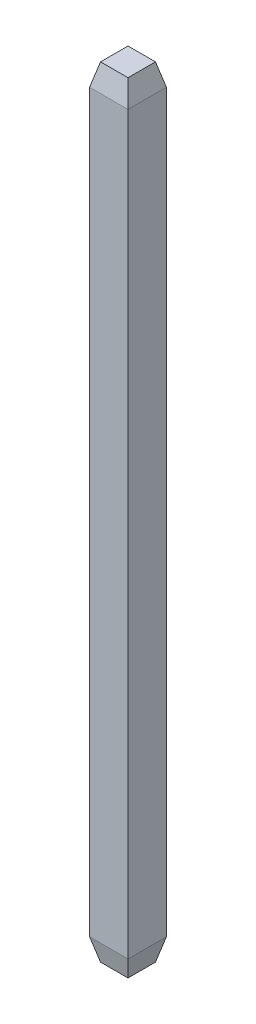
ISO-10303-21;
HEADER;
FILE_DESCRIPTION(('STEP AP214'),'2;1');
FILE_NAME('part.step','',(''),(''),'','','');
FILE_SCHEMA(('AUTOMOTIVE_DESIGN { 1 0 10303 214 1 1 1 1 }'));
ENDSEC;
DATA;
#1=APPLICATION_CONTEXT('core data for automotive mechanical design processes');
#2=APPLICATION_PROTOCOL_DEFINITION('international standard','automotive_design',2000,#1);
#3=PRODUCT_CONTEXT('',#1,'mechanical');
#4=PRODUCT('Part','Part','',(#3));
#5=PRODUCT_RELATED_PRODUCT_CATEGORY('part','',(#4));
#6=PRODUCT_DEFINITION_FORMATION('','',#4);
#7=PRODUCT_DEFINITION_CONTEXT('part definition',#1,'design');
#8=PRODUCT_DEFINITION('design','',#6,#7);
#9=PRODUCT_DEFINITION_SHAPE('','',#8);
#10=(LENGTH_UNIT() NAMED_UNIT(*) SI_UNIT(.MILLI.,.METRE.));
#11=(NAMED_UNIT(*) PLANE_ANGLE_UNIT() SI_UNIT($,.RADIAN.));
#12=(NAMED_UNIT(*) SI_UNIT($,.STERADIAN.) SOLID_ANGLE_UNIT());
#13=UNCERTAINTY_MEASURE_WITH_UNIT(LENGTH_MEASURE(1.E-05),#10,'distance_accuracy_value','');
#14=(GEOMETRIC_REPRESENTATION_CONTEXT(3) GLOBAL_UNCERTAINTY_ASSIGNED_CONTEXT((#13)) GLOBAL_UNIT_ASSIGNED_CONTEXT((#10,
#11,#12)) REPRESENTATION_CONTEXT('',''));
#15=CARTESIAN_POINT('',(0.,0.,0.));
#16=DIRECTION('',(0.,0.,1.));
#17=DIRECTION('',(1.,0.,0.));
#18=AXIS2_PLACEMENT_3D('',#15,#16,#17);
#19=CARTESIAN_POINT('',(-0.35,14.2,0.35));
#20=DIRECTION('',(1.,0.,0.));
#21=DIRECTION('',(0.,0.,-1.));
#22=AXIS2_PLACEMENT_3D('',#19,#20,#21);
#23=PLANE('',#22);
#24=DIRECTION('',(0.,-1.,0.));
#25=VECTOR('',#24,1.);
#26=CARTESIAN_POINT('',(-0.35,14.2,-0.35));
#27=LINE('',#26,#25);
#28=CARTESIAN_POINT('',(-0.35,13.8,-0.35));
#29=VERTEX_POINT('',#28);
#30=CARTESIAN_POINT('',(-0.35,0.400000000000003,-0.35));
#31=VERTEX_POINT('',#30);
#32=EDGE_CURVE('E120',#29,#31,#27,.T.);
#33=ORIENTED_EDGE('',*,*,#32,.T.);
#34=DIRECTION('',(0.,0.,1.));
#35=VECTOR('',#34,1.);
#36=CARTESIAN_POINT('',(-0.35,0.400000000000005,0.35));
#37=LINE('',#36,#35);
#38=CARTESIAN_POINT('',(-0.35,0.400000000000003,0.35));
#39=VERTEX_POINT('',#38);
#40=EDGE_CURVE('E160',#31,#39,#37,.T.);
#41=ORIENTED_EDGE('',*,*,#40,.T.);
#42=DIRECTION('',(0.,-1.,0.));
#43=VECTOR('',#42,1.);
#44=CARTESIAN_POINT('',(-0.35,14.2,0.35));
#45=LINE('',#44,#43);
#46=CARTESIAN_POINT('',(-0.35,13.8,0.35));
#47=VERTEX_POINT('',#46);
#48=EDGE_CURVE('E126',#47,#39,#45,.T.);
#49=ORIENTED_EDGE('',*,*,#48,.F.);
#50=DIRECTION('',(0.,0.,-1.));
#51=VECTOR('',#50,1.);
#52=CARTESIAN_POINT('',(-0.35,13.8,0.35));
#53=LINE('',#52,#51);
#54=EDGE_CURVE('E139',#47,#29,#53,.T.);
#55=ORIENTED_EDGE('',*,*,#54,.T.);
#56=EDGE_LOOP('',(#33,#41,#49,#55));
#57=FACE_BOUND('',#56,.T.);
#58=ADVANCED_FACE('F34',(#57),#23,.F.);
#59=CARTESIAN_POINT('',(-0.35,14.2,0.35));
#60=DIRECTION('',(0.,0.,-1.));
#61=DIRECTION('',(-1.,0.,0.));
#62=AXIS2_PLACEMENT_3D('',#59,#60,#61);
#63=PLANE('',#62);
#64=ORIENTED_EDGE('',*,*,#48,.T.);
#65=DIRECTION('',(1.,0.,0.));
#66=VECTOR('',#65,1.);
#67=CARTESIAN_POINT('',(0.35,0.400000000000005,0.35));
#68=LINE('',#67,#66);
#69=CARTESIAN_POINT('',(0.35,0.400000000000005,0.35));
#70=VERTEX_POINT('',#69);
#71=EDGE_CURVE('E144',#39,#70,#68,.T.);
#72=ORIENTED_EDGE('',*,*,#71,.T.);
#73=DIRECTION('',(0.,-1.,0.));
#74=VECTOR('',#73,1.);
#75=CARTESIAN_POINT('',(0.35,14.2,0.35));
#76=LINE('',#75,#74);
#77=CARTESIAN_POINT('',(0.35,13.8,0.35));
#78=VERTEX_POINT('',#77);
#79=EDGE_CURVE('E129',#78,#70,#76,.T.);
#80=ORIENTED_EDGE('',*,*,#79,.F.);
#81=DIRECTION('',(-1.,0.,0.));
#82=VECTOR('',#81,1.);
#83=CARTESIAN_POINT('',(-0.35,13.8,0.35));
#84=LINE('',#83,#82);
#85=EDGE_CURVE('E117',#78,#47,#84,.T.);
#86=ORIENTED_EDGE('',*,*,#85,.T.);
#87=EDGE_LOOP('',(#64,#72,#80,#86));
#88=FACE_BOUND('',#87,.T.);
#89=ADVANCED_FACE('F190',(#88),#63,.F.);
#90=CARTESIAN_POINT('',(0.35,14.2,0.35));
#91=DIRECTION('',(-1.,0.,0.));
#92=DIRECTION('',(0.,0.,1.));
#93=AXIS2_PLACEMENT_3D('',#90,#91,#92);
#94=PLANE('',#93);
#95=ORIENTED_EDGE('',*,*,#79,.T.);
#96=DIRECTION('',(0.,0.,-1.));
#97=VECTOR('',#96,1.);
#98=CARTESIAN_POINT('',(0.35,0.400000000000005,-0.35));
#99=LINE('',#98,#97);
#100=CARTESIAN_POINT('',(0.35,0.400000000000003,-0.35));
#101=VERTEX_POINT('',#100);
#102=EDGE_CURVE('E11',#70,#101,#99,.T.);
#103=ORIENTED_EDGE('',*,*,#102,.T.);
#104=DIRECTION('',(0.,-1.,0.));
#105=VECTOR('',#104,1.);
#106=CARTESIAN_POINT('',(0.35,14.2,-0.35));
#107=LINE('',#106,#105);
#108=CARTESIAN_POINT('',(0.35,13.8,-0.35));
#109=VERTEX_POINT('',#108);
#110=EDGE_CURVE('E193',#109,#101,#107,.T.);
#111=ORIENTED_EDGE('',*,*,#110,.F.);
#112=DIRECTION('',(0.,0.,1.));
#113=VECTOR('',#112,1.);
#114=CARTESIAN_POINT('',(0.35,13.8,0.35));
#115=LINE('',#114,#113);
#116=EDGE_CURVE('E142',#109,#78,#115,.T.);
#117=ORIENTED_EDGE('',*,*,#116,.T.);
#118=EDGE_LOOP('',(#95,#103,#111,#117));
#119=FACE_BOUND('',#118,.T.);
#120=ADVANCED_FACE('F192',(#119),#94,.F.);
#121=CARTESIAN_POINT('',(-0.35,14.2,-0.35));
#122=DIRECTION('',(0.,0.,1.));
#123=DIRECTION('',(1.,0.,0.));
#124=AXIS2_PLACEMENT_3D('',#121,#122,#123);
#125=PLANE('',#124);
#126=ORIENTED_EDGE('',*,*,#110,.T.);
#127=DIRECTION('',(-1.,0.,0.));
#128=VECTOR('',#127,1.);
#129=CARTESIAN_POINT('',(-0.35,0.400000000000005,-0.35));
#130=LINE('',#129,#128);
#131=EDGE_CURVE('E43',#101,#31,#130,.T.);
#132=ORIENTED_EDGE('',*,*,#131,.T.);
#133=ORIENTED_EDGE('',*,*,#32,.F.);
#134=DIRECTION('',(1.,0.,0.));
#135=VECTOR('',#134,1.);
#136=CARTESIAN_POINT('',(-0.35,13.8,-0.35));
#137=LINE('',#136,#135);
#138=EDGE_CURVE('E136',#29,#109,#137,.T.);
#139=ORIENTED_EDGE('',*,*,#138,.T.);
#140=EDGE_LOOP('',(#126,#132,#133,#139));
#141=FACE_BOUND('',#140,.T.);
#142=ADVANCED_FACE('F199',(#141),#125,.F.);
#143=CARTESIAN_POINT('',(0.,14.2,0.));
#144=DIRECTION('',(0.,-1.,0.));
#145=DIRECTION('',(0.,0.,-1.));
#146=AXIS2_PLACEMENT_3D('',#143,#144,#145);
#147=PLANE('',#146);
#148=DIRECTION('',(0.,0.,-1.));
#149=VECTOR('',#148,1.);
#150=CARTESIAN_POINT('',(0.25,14.2,0.));
#151=LINE('',#150,#149);
#152=CARTESIAN_POINT('',(0.25,14.2,0.25));
#153=VERTEX_POINT('',#152);
#154=CARTESIAN_POINT('',(0.25,14.2,-0.25));
#155=VERTEX_POINT('',#154);
#156=EDGE_CURVE('E105',#153,#155,#151,.T.);
#157=ORIENTED_EDGE('',*,*,#156,.T.);
#158=DIRECTION('',(-1.,0.,0.));
#159=VECTOR('',#158,1.);
#160=CARTESIAN_POINT('',(0.,14.2,-0.25));
#161=LINE('',#160,#159);
#162=CARTESIAN_POINT('',(-0.25,14.2,-0.25));
#163=VERTEX_POINT('',#162);
#164=EDGE_CURVE('E134',#155,#163,#161,.T.);
#165=ORIENTED_EDGE('',*,*,#164,.T.);
#166=DIRECTION('',(0.,0.,1.));
#167=VECTOR('',#166,1.);
#168=CARTESIAN_POINT('',(-0.25,14.2,0.));
#169=LINE('',#168,#167);
#170=CARTESIAN_POINT('',(-0.25,14.2,0.25));
#171=VERTEX_POINT('',#170);
#172=EDGE_CURVE('E108',#163,#171,#169,.T.);
#173=ORIENTED_EDGE('',*,*,#172,.T.);
#174=DIRECTION('',(1.,0.,0.));
#175=VECTOR('',#174,1.);
#176=CARTESIAN_POINT('',(0.,14.2,0.25));
#177=LINE('',#176,#175);
#178=EDGE_CURVE('E100',#171,#153,#177,.T.);
#179=ORIENTED_EDGE('',*,*,#178,.T.);
#180=EDGE_LOOP('',(#157,#165,#173,#179));
#181=FACE_BOUND('',#180,.T.);
#182=ADVANCED_FACE('F102',(#181),#147,.F.);
#183=CARTESIAN_POINT('',(0.,0.,0.));
#184=DIRECTION('',(0.,-1.,0.));
#185=DIRECTION('',(0.,0.,-1.));
#186=AXIS2_PLACEMENT_3D('',#183,#184,#185);
#187=PLANE('',#186);
#188=DIRECTION('',(0.,0.,1.));
#189=VECTOR('',#188,1.);
#190=CARTESIAN_POINT('',(0.25,0.,0.35));
#191=LINE('',#190,#189);
#192=CARTESIAN_POINT('',(0.25,0.,-0.25));
#193=VERTEX_POINT('',#192);
#194=CARTESIAN_POINT('',(0.25,0.,0.25));
#195=VERTEX_POINT('',#194);
#196=EDGE_CURVE('E151',#193,#195,#191,.T.);
#197=ORIENTED_EDGE('',*,*,#196,.T.);
#198=DIRECTION('',(-1.,0.,0.));
#199=VECTOR('',#198,1.);
#200=CARTESIAN_POINT('',(-0.35,0.,0.25));
#201=LINE('',#200,#199);
#202=CARTESIAN_POINT('',(-0.25,0.,0.25));
#203=VERTEX_POINT('',#202);
#204=EDGE_CURVE('E157',#195,#203,#201,.T.);
#205=ORIENTED_EDGE('',*,*,#204,.T.);
#206=DIRECTION('',(0.,0.,-1.));
#207=VECTOR('',#206,1.);
#208=CARTESIAN_POINT('',(-0.25,0.,-0.35));
#209=LINE('',#208,#207);
#210=CARTESIAN_POINT('',(-0.25,0.,-0.25));
#211=VERTEX_POINT('',#210);
#212=EDGE_CURVE('E155',#203,#211,#209,.T.);
#213=ORIENTED_EDGE('',*,*,#212,.T.);
#214=DIRECTION('',(1.,0.,0.));
#215=VECTOR('',#214,1.);
#216=CARTESIAN_POINT('',(0.35,0.,-0.25));
#217=LINE('',#216,#215);
#218=EDGE_CURVE('E153',#211,#193,#217,.T.);
#219=ORIENTED_EDGE('',*,*,#218,.T.);
#220=EDGE_LOOP('',(#197,#205,#213,#219));
#221=FACE_BOUND('',#220,.T.);
#222=ADVANCED_FACE('F181',(#221),#187,.T.);
#223=CARTESIAN_POINT('',(0.,14.2,0.25));
#224=DIRECTION('',(0.,-0.24253562503633,-0.970142500145333));
#225=DIRECTION('',(1.,0.,0.));
#226=AXIS2_PLACEMENT_3D('',#223,#224,#225);
#227=PLANE('',#226);
#228=DIRECTION('',(-0.235702260395513,-0.942809041582065,0.235702260395513));
#229=VECTOR('',#228,1.);
#230=CARTESIAN_POINT('',(-0.236111111111112,14.2555555555556,0.236111111111112));
#231=LINE('',#230,#229);
#232=EDGE_CURVE('E121',#47,#171,#231,.F.);
#233=ORIENTED_EDGE('',*,*,#232,.F.);
#234=ORIENTED_EDGE('',*,*,#85,.F.);
#235=DIRECTION('',(0.235702260395513,-0.942809041582065,0.235702260395513));
#236=VECTOR('',#235,1.);
#237=CARTESIAN_POINT('',(0.236111111111112,14.2555555555556,0.236111111111112));
#238=LINE('',#237,#236);
#239=EDGE_CURVE('E115',#153,#78,#238,.T.);
#240=ORIENTED_EDGE('',*,*,#239,.F.);
#241=ORIENTED_EDGE('',*,*,#178,.F.);
#242=EDGE_LOOP('',(#233,#234,#240,#241));
#243=FACE_BOUND('',#242,.T.);
#244=ADVANCED_FACE('F116',(#243),#227,.F.);
#245=CARTESIAN_POINT('',(0.25,14.2,0.));
#246=DIRECTION('',(-0.970142500145333,-0.24253562503633,0.));
#247=DIRECTION('',(0.,0.,-1.));
#248=AXIS2_PLACEMENT_3D('',#245,#246,#247);
#249=PLANE('',#248);
#250=ORIENTED_EDGE('',*,*,#239,.T.);
#251=ORIENTED_EDGE('',*,*,#116,.F.);
#252=DIRECTION('',(-0.235702260395513,0.942809041582065,0.235702260395513));
#253=VECTOR('',#252,1.);
#254=CARTESIAN_POINT('',(0.236111111111112,14.2555555555556,-0.236111111111112));
#255=LINE('',#254,#253);
#256=EDGE_CURVE('E124',#155,#109,#255,.F.);
#257=ORIENTED_EDGE('',*,*,#256,.F.);
#258=ORIENTED_EDGE('',*,*,#156,.F.);
#259=EDGE_LOOP('',(#250,#251,#257,#258));
#260=FACE_BOUND('',#259,.T.);
#261=ADVANCED_FACE('F123',(#260),#249,.F.);
#262=CARTESIAN_POINT('',(-0.25,14.2,0.));
#263=DIRECTION('',(0.970142500145333,-0.24253562503633,0.));
#264=DIRECTION('',(0.,0.,1.));
#265=AXIS2_PLACEMENT_3D('',#262,#263,#264);
#266=PLANE('',#265);
#267=ORIENTED_EDGE('',*,*,#232,.T.);
#268=ORIENTED_EDGE('',*,*,#172,.F.);
#269=DIRECTION('',(-0.235702260395513,-0.942809041582065,-0.235702260395513));
#270=VECTOR('',#269,1.);
#271=CARTESIAN_POINT('',(-0.236111111111112,14.2555555555556,-0.236111111111112));
#272=LINE('',#271,#270);
#273=EDGE_CURVE('E145',#29,#163,#272,.F.);
#274=ORIENTED_EDGE('',*,*,#273,.F.);
#275=ORIENTED_EDGE('',*,*,#54,.F.);
#276=EDGE_LOOP('',(#267,#268,#274,#275));
#277=FACE_BOUND('',#276,.T.);
#278=ADVANCED_FACE('F204',(#277),#266,.F.);
#279=CARTESIAN_POINT('',(0.,14.2,-0.25));
#280=DIRECTION('',(0.,-0.24253562503633,0.970142500145333));
#281=DIRECTION('',(-1.,0.,0.));
#282=AXIS2_PLACEMENT_3D('',#279,#280,#281);
#283=PLANE('',#282);
#284=ORIENTED_EDGE('',*,*,#256,.T.);
#285=ORIENTED_EDGE('',*,*,#138,.F.);
#286=ORIENTED_EDGE('',*,*,#273,.T.);
#287=ORIENTED_EDGE('',*,*,#164,.F.);
#288=EDGE_LOOP('',(#284,#285,#286,#287));
#289=FACE_BOUND('',#288,.T.);
#290=ADVANCED_FACE('F202',(#289),#283,.F.);
#291=CARTESIAN_POINT('',(-0.35,0.400000000000005,-0.35));
#292=DIRECTION('',(0.,-0.24253562503633,-0.970142500145333));
#293=DIRECTION('',(1.,0.,0.));
#294=AXIS2_PLACEMENT_3D('',#291,#292,#293);
#295=PLANE('',#294);
#296=DIRECTION('',(0.235702260395513,0.942809041582065,-0.235702260395513));
#297=VECTOR('',#296,1.);
#298=CARTESIAN_POINT('',(0.311111111111112,0.244444444444451,-0.311111111111112));
#299=LINE('',#298,#297);
#300=EDGE_CURVE('E166',#193,#101,#299,.T.);
#301=ORIENTED_EDGE('',*,*,#300,.F.);
#302=ORIENTED_EDGE('',*,*,#218,.F.);
#303=DIRECTION('',(-0.235702260395513,0.942809041582065,-0.235702260395513));
#304=VECTOR('',#303,1.);
#305=CARTESIAN_POINT('',(-0.35,0.400000000000005,-0.35));
#306=LINE('',#305,#304);
#307=EDGE_CURVE('E38',#31,#211,#306,.F.);
#308=ORIENTED_EDGE('',*,*,#307,.F.);
#309=ORIENTED_EDGE('',*,*,#131,.F.);
#310=EDGE_LOOP('',(#301,#302,#308,#309));
#311=FACE_BOUND('',#310,.T.);
#312=ADVANCED_FACE('F36',(#311),#295,.T.);
#313=CARTESIAN_POINT('',(-0.35,0.400000000000005,0.35));
#314=DIRECTION('',(-0.970142500145333,-0.24253562503633,0.));
#315=DIRECTION('',(0.,0.,-1.));
#316=AXIS2_PLACEMENT_3D('',#313,#314,#315);
#317=PLANE('',#316);
#318=ORIENTED_EDGE('',*,*,#307,.T.);
#319=ORIENTED_EDGE('',*,*,#212,.F.);
#320=DIRECTION('',(-0.235702260395513,0.942809041582065,0.235702260395513));
#321=VECTOR('',#320,1.);
#322=CARTESIAN_POINT('',(-0.35,0.400000000000005,0.35));
#323=LINE('',#322,#321);
#324=EDGE_CURVE('E165',#39,#203,#323,.F.);
#325=ORIENTED_EDGE('',*,*,#324,.F.);
#326=ORIENTED_EDGE('',*,*,#40,.F.);
#327=EDGE_LOOP('',(#318,#319,#325,#326));
#328=FACE_BOUND('',#327,.T.);
#329=ADVANCED_FACE('F176',(#328),#317,.T.);
#330=CARTESIAN_POINT('',(0.35,0.400000000000005,0.35));
#331=DIRECTION('',(0.970142500145333,-0.24253562503633,0.));
#332=DIRECTION('',(0.,0.,1.));
#333=AXIS2_PLACEMENT_3D('',#330,#331,#332);
#334=PLANE('',#333);
#335=ORIENTED_EDGE('',*,*,#300,.T.);
#336=ORIENTED_EDGE('',*,*,#102,.F.);
#337=DIRECTION('',(-0.235702260395513,-0.942809041582065,-0.235702260395513));
#338=VECTOR('',#337,1.);
#339=CARTESIAN_POINT('',(0.35,0.400000000000005,0.35));
#340=LINE('',#339,#338);
#341=EDGE_CURVE('E163',#195,#70,#340,.F.);
#342=ORIENTED_EDGE('',*,*,#341,.F.);
#343=ORIENTED_EDGE('',*,*,#196,.F.);
#344=EDGE_LOOP('',(#335,#336,#342,#343));
#345=FACE_BOUND('',#344,.T.);
#346=ADVANCED_FACE('F187',(#345),#334,.T.);
#347=CARTESIAN_POINT('',(-0.35,0.400000000000005,0.35));
#348=DIRECTION('',(0.,-0.24253562503633,0.970142500145333));
#349=DIRECTION('',(-1.,0.,0.));
#350=AXIS2_PLACEMENT_3D('',#347,#348,#349);
#351=PLANE('',#350);
#352=ORIENTED_EDGE('',*,*,#324,.T.);
#353=ORIENTED_EDGE('',*,*,#204,.F.);
#354=ORIENTED_EDGE('',*,*,#341,.T.);
#355=ORIENTED_EDGE('',*,*,#71,.F.);
#356=EDGE_LOOP('',(#352,#353,#354,#355));
#357=FACE_BOUND('',#356,.T.);
#358=ADVANCED_FACE('F185',(#357),#351,.T.);
#359=CLOSED_SHELL('',(#58,#89,#120,#142,#182,#222,#244,#261,#278,#290,#312,#329,#346,#358));
#360=MANIFOLD_SOLID_BREP('B2',#359);
#361=ADVANCED_BREP_SHAPE_REPRESENTATION('',(#18,#360),#14);
#362=SHAPE_DEFINITION_REPRESENTATION(#9,#361);
ENDSEC;
END-ISO-10303-21;
